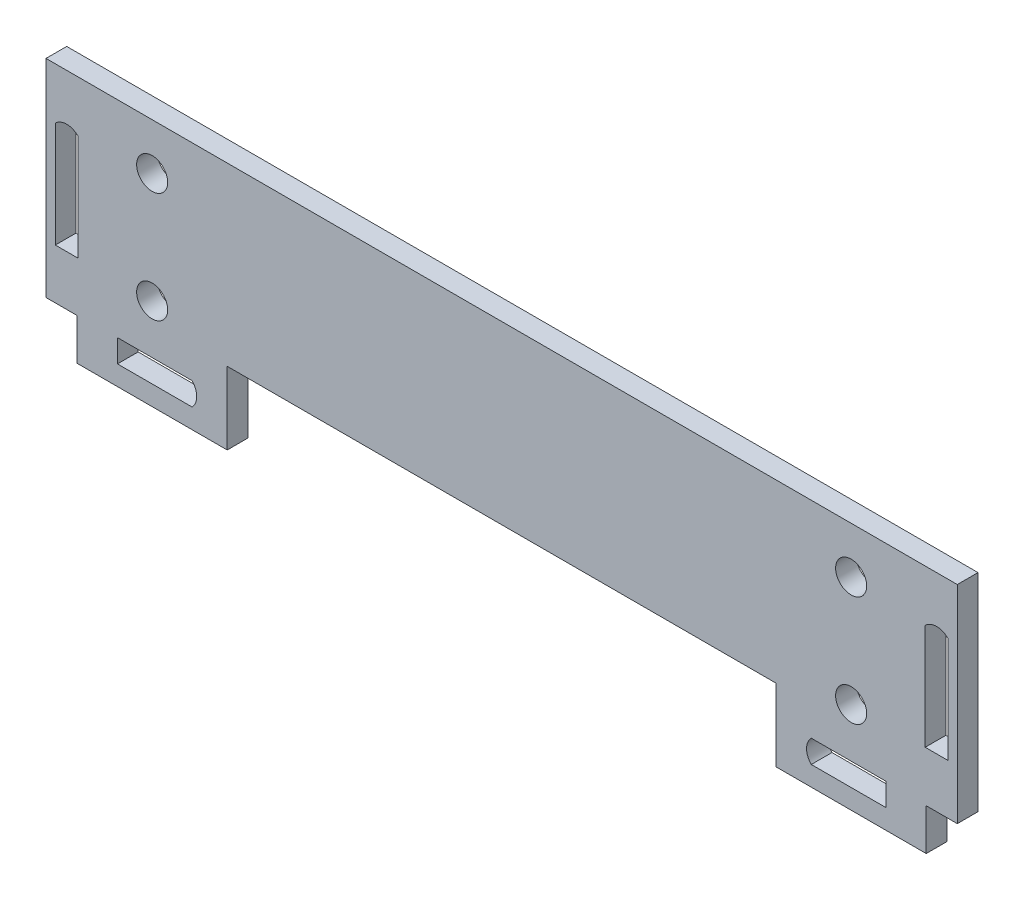
ISO-10303-21;
HEADER;
FILE_DESCRIPTION(('STEP AP214'),'2;1');
FILE_NAME('part.step','',(''),(''),'','','');
FILE_SCHEMA(('AUTOMOTIVE_DESIGN { 1 0 10303 214 1 1 1 1 }'));
ENDSEC;
DATA;
#1=APPLICATION_CONTEXT('core data for automotive mechanical design processes');
#2=APPLICATION_PROTOCOL_DEFINITION('international standard','automotive_design',2000,#1);
#3=PRODUCT_CONTEXT('',#1,'mechanical');
#4=PRODUCT('Part','Part','',(#3));
#5=PRODUCT_RELATED_PRODUCT_CATEGORY('part','',(#4));
#6=PRODUCT_DEFINITION_FORMATION('','',#4);
#7=PRODUCT_DEFINITION_CONTEXT('part definition',#1,'design');
#8=PRODUCT_DEFINITION('design','',#6,#7);
#9=PRODUCT_DEFINITION_SHAPE('','',#8);
#10=(LENGTH_UNIT() NAMED_UNIT(*) SI_UNIT(.MILLI.,.METRE.));
#11=(NAMED_UNIT(*) PLANE_ANGLE_UNIT() SI_UNIT($,.RADIAN.));
#12=(NAMED_UNIT(*) SI_UNIT($,.STERADIAN.) SOLID_ANGLE_UNIT());
#13=UNCERTAINTY_MEASURE_WITH_UNIT(LENGTH_MEASURE(1.E-05),#10,'distance_accuracy_value','');
#14=(GEOMETRIC_REPRESENTATION_CONTEXT(3) GLOBAL_UNCERTAINTY_ASSIGNED_CONTEXT((#13)) GLOBAL_UNIT_ASSIGNED_CONTEXT((#10,
#11,#12)) REPRESENTATION_CONTEXT('',''));
#15=CARTESIAN_POINT('',(0.,0.,0.));
#16=DIRECTION('',(0.,0.,1.));
#17=DIRECTION('',(1.,0.,0.));
#18=AXIS2_PLACEMENT_3D('',#15,#16,#17);
#19=CARTESIAN_POINT('',(0.,0.,2.));
#20=DIRECTION('',(0.,0.,1.));
#21=DIRECTION('',(1.,0.,0.));
#22=AXIS2_PLACEMENT_3D('',#19,#20,#21);
#23=PLANE('',#22);
#24=CARTESIAN_POINT('',(-33.7499999999939,4.84978331472722,2.));
#25=DIRECTION('',(0.,0.,1.));
#26=DIRECTION('',(1.,0.,0.));
#27=AXIS2_PLACEMENT_3D('',#24,#25,#26);
#28=CIRCLE('',#27,1.5);
#29=CARTESIAN_POINT('',(-32.2499999999939,4.84978331472722,2.));
#30=VERTEX_POINT('',#29);
#31=EDGE_CURVE('E830',#30,#30,#28,.T.);
#32=ORIENTED_EDGE('',*,*,#31,.F.);
#33=EDGE_LOOP('',(#32));
#34=FACE_BOUND('',#33,.T.);
#35=CARTESIAN_POINT('',(33.7499999999939,4.84978331472722,2.));
#36=DIRECTION('',(0.,0.,1.));
#37=DIRECTION('',(-1.,0.,0.));
#38=AXIS2_PLACEMENT_3D('',#35,#36,#37);
#39=CIRCLE('',#38,1.5);
#40=CARTESIAN_POINT('',(32.2499999999939,4.84978331472722,2.));
#41=VERTEX_POINT('',#40);
#42=EDGE_CURVE('E247',#41,#41,#39,.T.);
#43=ORIENTED_EDGE('',*,*,#42,.F.);
#44=EDGE_LOOP('',(#43));
#45=FACE_BOUND('',#44,.T.);
#46=DIRECTION('',(1.,0.,0.));
#47=VECTOR('',#46,1.);
#48=CARTESIAN_POINT('',(40.9999999999946,0.00978331472900346,2.));
#49=LINE('',#48,#47);
#50=CARTESIAN_POINT('',(40.9999999999946,0.00978331472900346,2.));
#51=VERTEX_POINT('',#50);
#52=CARTESIAN_POINT('',(43.9999999999958,0.00978331472900346,2.));
#53=VERTEX_POINT('',#52);
#54=EDGE_CURVE('E350',#51,#53,#49,.T.);
#55=ORIENTED_EDGE('',*,*,#54,.T.);
#56=DIRECTION('',(0.,1.,0.));
#57=VECTOR('',#56,1.);
#58=CARTESIAN_POINT('',(43.9999999999958,0.00978331472900346,2.));
#59=LINE('',#58,#57);
#60=CARTESIAN_POINT('',(43.9999999999958,20.0097833147254,2.));
#61=VERTEX_POINT('',#60);
#62=EDGE_CURVE('E353',#53,#61,#59,.T.);
#63=ORIENTED_EDGE('',*,*,#62,.T.);
#64=DIRECTION('',(-1.,0.,0.));
#65=VECTOR('',#64,1.);
#66=CARTESIAN_POINT('',(43.9999999999958,20.0097833147254,2.));
#67=LINE('',#66,#65);
#68=CARTESIAN_POINT('',(-43.9999999999958,20.0097833147254,2.));
#69=VERTEX_POINT('',#68);
#70=EDGE_CURVE('E356',#61,#69,#67,.T.);
#71=ORIENTED_EDGE('',*,*,#70,.T.);
#72=DIRECTION('',(0.,-1.,0.));
#73=VECTOR('',#72,1.);
#74=CARTESIAN_POINT('',(-43.9999999999958,15.0097833147254,2.));
#75=LINE('',#74,#73);
#76=CARTESIAN_POINT('',(-43.9999999999958,0.00978331472900346,2.));
#77=VERTEX_POINT('',#76);
#78=EDGE_CURVE('E358',#69,#77,#75,.T.);
#79=ORIENTED_EDGE('',*,*,#78,.T.);
#80=DIRECTION('',(1.,0.,0.));
#81=VECTOR('',#80,1.);
#82=CARTESIAN_POINT('',(-40.9999999999946,0.00978331472900346,2.));
#83=LINE('',#82,#81);
#84=CARTESIAN_POINT('',(-40.9999999999946,0.00978331472900346,2.));
#85=VERTEX_POINT('',#84);
#86=EDGE_CURVE('E360',#77,#85,#83,.T.);
#87=ORIENTED_EDGE('',*,*,#86,.T.);
#88=DIRECTION('',(0.,-1.,0.));
#89=VECTOR('',#88,1.);
#90=CARTESIAN_POINT('',(-40.9999999999946,0.00978331472900346,2.));
#91=LINE('',#90,#89);
#92=CARTESIAN_POINT('',(-40.9999999999946,-3.990216685271,2.));
#93=VERTEX_POINT('',#92);
#94=EDGE_CURVE('E362',#85,#93,#91,.T.);
#95=ORIENTED_EDGE('',*,*,#94,.T.);
#96=DIRECTION('',(1.,0.,0.));
#97=VECTOR('',#96,1.);
#98=CARTESIAN_POINT('',(-40.9999999999946,-3.990216685271,2.));
#99=LINE('',#98,#97);
#100=CARTESIAN_POINT('',(-26.4999999999946,-3.990216685271,2.));
#101=VERTEX_POINT('',#100);
#102=EDGE_CURVE('E364',#93,#101,#99,.T.);
#103=ORIENTED_EDGE('',*,*,#102,.T.);
#104=DIRECTION('',(0.,1.,0.));
#105=VECTOR('',#104,1.);
#106=CARTESIAN_POINT('',(-26.4999999999946,-3.990216685271,2.));
#107=LINE('',#106,#105);
#108=CARTESIAN_POINT('',(-26.4999999999946,3.009783314729,2.));
#109=VERTEX_POINT('',#108);
#110=EDGE_CURVE('E366',#101,#109,#107,.T.);
#111=ORIENTED_EDGE('',*,*,#110,.T.);
#112=DIRECTION('',(1.,0.,0.));
#113=VECTOR('',#112,1.);
#114=CARTESIAN_POINT('',(-26.4999999999946,3.009783314729,2.));
#115=LINE('',#114,#113);
#116=CARTESIAN_POINT('',(26.4999999999946,3.009783314729,2.));
#117=VERTEX_POINT('',#116);
#118=EDGE_CURVE('E368',#109,#117,#115,.T.);
#119=ORIENTED_EDGE('',*,*,#118,.T.);
#120=DIRECTION('',(0.,-1.,0.));
#121=VECTOR('',#120,1.);
#122=CARTESIAN_POINT('',(26.4999999999946,-3.990216685271,2.));
#123=LINE('',#122,#121);
#124=CARTESIAN_POINT('',(26.4999999999946,-3.990216685271,2.));
#125=VERTEX_POINT('',#124);
#126=EDGE_CURVE('E370',#117,#125,#123,.T.);
#127=ORIENTED_EDGE('',*,*,#126,.T.);
#128=DIRECTION('',(1.,0.,0.));
#129=VECTOR('',#128,1.);
#130=CARTESIAN_POINT('',(40.9999999999946,-3.990216685271,2.));
#131=LINE('',#130,#129);
#132=CARTESIAN_POINT('',(40.9999999999946,-3.990216685271,2.));
#133=VERTEX_POINT('',#132);
#134=EDGE_CURVE('E372',#125,#133,#131,.T.);
#135=ORIENTED_EDGE('',*,*,#134,.T.);
#136=DIRECTION('',(0.,1.,0.));
#137=VECTOR('',#136,1.);
#138=CARTESIAN_POINT('',(40.9999999999946,0.00978331472900346,2.));
#139=LINE('',#138,#137);
#140=EDGE_CURVE('E374',#133,#51,#139,.T.);
#141=ORIENTED_EDGE('',*,*,#140,.T.);
#142=EDGE_LOOP('',(#55,#63,#71,#79,#87,#95,#103,#111,#119,#127,#135,#141));
#143=FACE_BOUND('',#142,.T.);
#144=CARTESIAN_POINT('',(41.9999999999946,13.9497833147272,2.));
#145=DIRECTION('',(0.,0.,1.));
#146=DIRECTION('',(-1.,0.,0.));
#147=AXIS2_PLACEMENT_3D('',#144,#145,#146);
#148=CIRCLE('',#147,1.55563491861041);
#149=CARTESIAN_POINT('',(43.0999999999946,15.0497833147272,2.));
#150=VERTEX_POINT('',#149);
#151=CARTESIAN_POINT('',(40.8999999999946,15.0497833147272,2.));
#152=VERTEX_POINT('',#151);
#153=EDGE_CURVE('E321',#150,#152,#148,.T.);
#154=ORIENTED_EDGE('',*,*,#153,.F.);
#155=DIRECTION('',(0.,1.,0.));
#156=VECTOR('',#155,1.);
#157=CARTESIAN_POINT('',(43.0999999999946,15.0497833147272,2.));
#158=LINE('',#157,#156);
#159=CARTESIAN_POINT('',(43.0999999999946,4.84978331472722,2.));
#160=VERTEX_POINT('',#159);
#161=EDGE_CURVE('E319',#160,#150,#158,.T.);
#162=ORIENTED_EDGE('',*,*,#161,.F.);
#163=DIRECTION('',(1.,0.,0.));
#164=VECTOR('',#163,1.);
#165=CARTESIAN_POINT('',(43.0999999999946,4.84978331472722,2.));
#166=LINE('',#165,#164);
#167=CARTESIAN_POINT('',(40.8999999999946,4.84978331472722,2.));
#168=VERTEX_POINT('',#167);
#169=EDGE_CURVE('E327',#168,#160,#166,.T.);
#170=ORIENTED_EDGE('',*,*,#169,.F.);
#171=DIRECTION('',(0.,-1.,0.));
#172=VECTOR('',#171,1.);
#173=CARTESIAN_POINT('',(40.8999999999946,15.0497833147272,2.));
#174=LINE('',#173,#172);
#175=EDGE_CURVE('E324',#152,#168,#174,.T.);
#176=ORIENTED_EDGE('',*,*,#175,.F.);
#177=EDGE_LOOP('',(#154,#162,#170,#176));
#178=FACE_BOUND('',#177,.T.);
#179=DIRECTION('',(-1.,0.,0.));
#180=VECTOR('',#179,1.);
#181=CARTESIAN_POINT('',(-37.0999999999946,0.109783314729003,2.));
#182=LINE('',#181,#180);
#183=CARTESIAN_POINT('',(-29.8999999999946,0.109783314729003,2.));
#184=VERTEX_POINT('',#183);
#185=CARTESIAN_POINT('',(-37.0999999999946,0.109783314729003,2.));
#186=VERTEX_POINT('',#185);
#187=EDGE_CURVE('E290',#184,#186,#182,.T.);
#188=ORIENTED_EDGE('',*,*,#187,.F.);
#189=CARTESIAN_POINT('',(-30.9999999999946,-0.990216685270997,2.));
#190=DIRECTION('',(0.,0.,1.));
#191=DIRECTION('',(-1.,0.,0.));
#192=AXIS2_PLACEMENT_3D('',#189,#190,#191);
#193=CIRCLE('',#192,1.5556349186104);
#194=CARTESIAN_POINT('',(-29.8999999999946,-2.090216685271,2.));
#195=VERTEX_POINT('',#194);
#196=EDGE_CURVE('E288',#195,#184,#193,.T.);
#197=ORIENTED_EDGE('',*,*,#196,.F.);
#198=DIRECTION('',(1.,0.,0.));
#199=VECTOR('',#198,1.);
#200=CARTESIAN_POINT('',(-37.0999999999946,-2.090216685271,2.));
#201=LINE('',#200,#199);
#202=CARTESIAN_POINT('',(-37.0999999999946,-2.090216685271,2.));
#203=VERTEX_POINT('',#202);
#204=EDGE_CURVE('E296',#203,#195,#201,.T.);
#205=ORIENTED_EDGE('',*,*,#204,.F.);
#206=DIRECTION('',(0.,-1.,0.));
#207=VECTOR('',#206,1.);
#208=CARTESIAN_POINT('',(-37.0999999999946,-2.090216685271,2.));
#209=LINE('',#208,#207);
#210=EDGE_CURVE('E293',#186,#203,#209,.T.);
#211=ORIENTED_EDGE('',*,*,#210,.F.);
#212=EDGE_LOOP('',(#188,#197,#205,#211));
#213=FACE_BOUND('',#212,.T.);
#214=CARTESIAN_POINT('',(-41.9999999999946,13.9497833147272,2.));
#215=DIRECTION('',(0.,0.,1.));
#216=DIRECTION('',(-1.,0.,0.));
#217=AXIS2_PLACEMENT_3D('',#214,#215,#216);
#218=CIRCLE('',#217,1.5556349186104);
#219=CARTESIAN_POINT('',(-40.8999999999946,15.0497833147272,2.));
#220=VERTEX_POINT('',#219);
#221=CARTESIAN_POINT('',(-43.0999999999946,15.0497833147272,2.));
#222=VERTEX_POINT('',#221);
#223=EDGE_CURVE('E259',#220,#222,#218,.T.);
#224=ORIENTED_EDGE('',*,*,#223,.F.);
#225=DIRECTION('',(0.,1.,0.));
#226=VECTOR('',#225,1.);
#227=CARTESIAN_POINT('',(-40.8999999999946,15.0497833147272,2.));
#228=LINE('',#227,#226);
#229=CARTESIAN_POINT('',(-40.8999999999946,4.84978331472722,2.));
#230=VERTEX_POINT('',#229);
#231=EDGE_CURVE('E257',#230,#220,#228,.T.);
#232=ORIENTED_EDGE('',*,*,#231,.F.);
#233=DIRECTION('',(1.,0.,0.));
#234=VECTOR('',#233,1.);
#235=CARTESIAN_POINT('',(-43.0999999999946,4.84978331472722,2.));
#236=LINE('',#235,#234);
#237=CARTESIAN_POINT('',(-43.0999999999946,4.84978331472722,2.));
#238=VERTEX_POINT('',#237);
#239=EDGE_CURVE('E265',#238,#230,#236,.T.);
#240=ORIENTED_EDGE('',*,*,#239,.F.);
#241=DIRECTION('',(0.,-1.,0.));
#242=VECTOR('',#241,1.);
#243=CARTESIAN_POINT('',(-43.0999999999946,15.0497833147272,2.));
#244=LINE('',#243,#242);
#245=EDGE_CURVE('E262',#222,#238,#244,.T.);
#246=ORIENTED_EDGE('',*,*,#245,.F.);
#247=EDGE_LOOP('',(#224,#232,#240,#246));
#248=FACE_BOUND('',#247,.T.);
#249=DIRECTION('',(1.,0.,0.));
#250=VECTOR('',#249,1.);
#251=CARTESIAN_POINT('',(37.0999999999946,-2.090216685271,2.));
#252=LINE('',#251,#250);
#253=CARTESIAN_POINT('',(29.8999999999946,-2.090216685271,2.));
#254=VERTEX_POINT('',#253);
#255=CARTESIAN_POINT('',(37.0999999999946,-2.090216685271,2.));
#256=VERTEX_POINT('',#255);
#257=EDGE_CURVE('E226',#254,#256,#252,.T.);
#258=ORIENTED_EDGE('',*,*,#257,.F.);
#259=CARTESIAN_POINT('',(30.9999999999946,-0.990216685270997,2.));
#260=DIRECTION('',(0.,0.,1.));
#261=DIRECTION('',(1.,0.,0.));
#262=AXIS2_PLACEMENT_3D('',#259,#260,#261);
#263=CIRCLE('',#262,1.5556349186104);
#264=CARTESIAN_POINT('',(29.8999999999946,0.109783314729003,2.));
#265=VERTEX_POINT('',#264);
#266=EDGE_CURVE('E218',#265,#254,#263,.T.);
#267=ORIENTED_EDGE('',*,*,#266,.F.);
#268=DIRECTION('',(-1.,0.,0.));
#269=VECTOR('',#268,1.);
#270=CARTESIAN_POINT('',(37.0999999999946,0.109783314729003,2.));
#271=LINE('',#270,#269);
#272=CARTESIAN_POINT('',(37.0999999999946,0.109783314729003,2.));
#273=VERTEX_POINT('',#272);
#274=EDGE_CURVE('E241',#273,#265,#271,.T.);
#275=ORIENTED_EDGE('',*,*,#274,.F.);
#276=DIRECTION('',(0.,1.,0.));
#277=VECTOR('',#276,1.);
#278=CARTESIAN_POINT('',(37.0999999999946,-2.090216685271,2.));
#279=LINE('',#278,#277);
#280=EDGE_CURVE('E239',#256,#273,#279,.T.);
#281=ORIENTED_EDGE('',*,*,#280,.F.);
#282=EDGE_LOOP('',(#258,#267,#275,#281));
#283=FACE_BOUND('',#282,.T.);
#284=CARTESIAN_POINT('',(-33.7499999999939,15.5097833147272,2.));
#285=DIRECTION('',(0.,0.,1.));
#286=DIRECTION('',(1.,0.,0.));
#287=AXIS2_PLACEMENT_3D('',#284,#285,#286);
#288=CIRCLE('',#287,1.5);
#289=CARTESIAN_POINT('',(-32.2499999999939,15.5097833147272,2.));
#290=VERTEX_POINT('',#289);
#291=EDGE_CURVE('E836',#290,#290,#288,.T.);
#292=ORIENTED_EDGE('',*,*,#291,.F.);
#293=EDGE_LOOP('',(#292));
#294=FACE_BOUND('',#293,.T.);
#295=CARTESIAN_POINT('',(33.7499999999939,15.5097833147272,2.));
#296=DIRECTION('',(0.,0.,1.));
#297=DIRECTION('',(-1.,0.,0.));
#298=AXIS2_PLACEMENT_3D('',#295,#296,#297);
#299=CIRCLE('',#298,1.5);
#300=CARTESIAN_POINT('',(32.2499999999939,15.5097833147272,2.));
#301=VERTEX_POINT('',#300);
#302=EDGE_CURVE('E821',#301,#301,#299,.T.);
#303=ORIENTED_EDGE('',*,*,#302,.F.);
#304=EDGE_LOOP('',(#303));
#305=FACE_BOUND('',#304,.T.);
#306=ADVANCED_FACE('F33',(#34,#45,#143,#178,#213,#248,#283,#294,#305),#23,.T.);
#307=CARTESIAN_POINT('',(0.,0.,0.));
#308=DIRECTION('',(0.,0.,1.));
#309=DIRECTION('',(1.,0.,0.));
#310=AXIS2_PLACEMENT_3D('',#307,#308,#309);
#311=PLANE('',#310);
#312=DIRECTION('',(0.,1.,0.));
#313=VECTOR('',#312,1.);
#314=CARTESIAN_POINT('',(-40.8999999999946,15.0497833147272,0.));
#315=LINE('',#314,#313);
#316=CARTESIAN_POINT('',(-40.8999999999946,4.84978331472722,0.));
#317=VERTEX_POINT('',#316);
#318=CARTESIAN_POINT('',(-40.8999999999946,15.0497833147272,0.));
#319=VERTEX_POINT('',#318);
#320=EDGE_CURVE('E234',#317,#319,#315,.T.);
#321=ORIENTED_EDGE('',*,*,#320,.T.);
#322=CARTESIAN_POINT('',(-41.9999999999946,13.9497833147272,0.));
#323=DIRECTION('',(0.,0.,1.));
#324=DIRECTION('',(-1.,0.,0.));
#325=AXIS2_PLACEMENT_3D('',#322,#323,#324);
#326=CIRCLE('',#325,1.5556349186104);
#327=CARTESIAN_POINT('',(-43.0999999999946,15.0497833147272,0.));
#328=VERTEX_POINT('',#327);
#329=EDGE_CURVE('E270',#319,#328,#326,.T.);
#330=ORIENTED_EDGE('',*,*,#329,.T.);
#331=DIRECTION('',(0.,-1.,0.));
#332=VECTOR('',#331,1.);
#333=CARTESIAN_POINT('',(-43.0999999999946,15.0497833147272,0.));
#334=LINE('',#333,#332);
#335=CARTESIAN_POINT('',(-43.0999999999946,4.84978331472722,0.));
#336=VERTEX_POINT('',#335);
#337=EDGE_CURVE('E273',#328,#336,#334,.T.);
#338=ORIENTED_EDGE('',*,*,#337,.T.);
#339=DIRECTION('',(1.,0.,0.));
#340=VECTOR('',#339,1.);
#341=CARTESIAN_POINT('',(-43.0999999999946,4.84978331472722,0.));
#342=LINE('',#341,#340);
#343=EDGE_CURVE('E260',#336,#317,#342,.T.);
#344=ORIENTED_EDGE('',*,*,#343,.T.);
#345=EDGE_LOOP('',(#321,#330,#338,#344));
#346=FACE_BOUND('',#345,.T.);
#347=DIRECTION('',(0.,1.,0.));
#348=VECTOR('',#347,1.);
#349=CARTESIAN_POINT('',(43.0999999999946,15.0497833147272,0.));
#350=LINE('',#349,#348);
#351=CARTESIAN_POINT('',(43.0999999999946,4.84978331472722,0.));
#352=VERTEX_POINT('',#351);
#353=CARTESIAN_POINT('',(43.0999999999946,15.0497833147272,0.));
#354=VERTEX_POINT('',#353);
#355=EDGE_CURVE('E318',#352,#354,#350,.T.);
#356=ORIENTED_EDGE('',*,*,#355,.T.);
#357=CARTESIAN_POINT('',(41.9999999999946,13.9497833147272,0.));
#358=DIRECTION('',(0.,0.,1.));
#359=DIRECTION('',(-1.,0.,0.));
#360=AXIS2_PLACEMENT_3D('',#357,#358,#359);
#361=CIRCLE('',#360,1.55563491861041);
#362=CARTESIAN_POINT('',(40.8999999999946,15.0497833147272,0.));
#363=VERTEX_POINT('',#362);
#364=EDGE_CURVE('E332',#354,#363,#361,.T.);
#365=ORIENTED_EDGE('',*,*,#364,.T.);
#366=DIRECTION('',(0.,-1.,0.));
#367=VECTOR('',#366,1.);
#368=CARTESIAN_POINT('',(40.8999999999946,15.0497833147272,0.));
#369=LINE('',#368,#367);
#370=CARTESIAN_POINT('',(40.8999999999946,4.84978331472722,0.));
#371=VERTEX_POINT('',#370);
#372=EDGE_CURVE('E335',#363,#371,#369,.T.);
#373=ORIENTED_EDGE('',*,*,#372,.T.);
#374=DIRECTION('',(1.,0.,0.));
#375=VECTOR('',#374,1.);
#376=CARTESIAN_POINT('',(43.0999999999946,4.84978331472722,0.));
#377=LINE('',#376,#375);
#378=EDGE_CURVE('E322',#371,#352,#377,.T.);
#379=ORIENTED_EDGE('',*,*,#378,.T.);
#380=EDGE_LOOP('',(#356,#365,#373,#379));
#381=FACE_BOUND('',#380,.T.);
#382=DIRECTION('',(1.,0.,0.));
#383=VECTOR('',#382,1.);
#384=CARTESIAN_POINT('',(40.9999999999946,0.00978331472900346,0.));
#385=LINE('',#384,#383);
#386=CARTESIAN_POINT('',(40.9999999999946,0.00978331472900346,0.));
#387=VERTEX_POINT('',#386);
#388=CARTESIAN_POINT('',(43.9999999999958,0.00978331472900346,0.));
#389=VERTEX_POINT('',#388);
#390=EDGE_CURVE('E349',#387,#389,#385,.T.);
#391=ORIENTED_EDGE('',*,*,#390,.F.);
#392=DIRECTION('',(0.,1.,0.));
#393=VECTOR('',#392,1.);
#394=CARTESIAN_POINT('',(40.9999999999946,0.00978331472900346,0.));
#395=LINE('',#394,#393);
#396=CARTESIAN_POINT('',(40.9999999999946,-3.990216685271,0.));
#397=VERTEX_POINT('',#396);
#398=EDGE_CURVE('E354',#397,#387,#395,.T.);
#399=ORIENTED_EDGE('',*,*,#398,.F.);
#400=DIRECTION('',(1.,0.,0.));
#401=VECTOR('',#400,1.);
#402=CARTESIAN_POINT('',(40.9999999999946,-3.990216685271,0.));
#403=LINE('',#402,#401);
#404=CARTESIAN_POINT('',(26.4999999999946,-3.990216685271,0.));
#405=VERTEX_POINT('',#404);
#406=EDGE_CURVE('E399',#405,#397,#403,.T.);
#407=ORIENTED_EDGE('',*,*,#406,.F.);
#408=DIRECTION('',(0.,-1.,0.));
#409=VECTOR('',#408,1.);
#410=CARTESIAN_POINT('',(26.4999999999946,-3.990216685271,0.));
#411=LINE('',#410,#409);
#412=CARTESIAN_POINT('',(26.4999999999946,3.009783314729,0.));
#413=VERTEX_POINT('',#412);
#414=EDGE_CURVE('E397',#413,#405,#411,.T.);
#415=ORIENTED_EDGE('',*,*,#414,.F.);
#416=DIRECTION('',(1.,0.,0.));
#417=VECTOR('',#416,1.);
#418=CARTESIAN_POINT('',(-26.4999999999946,3.009783314729,0.));
#419=LINE('',#418,#417);
#420=CARTESIAN_POINT('',(-26.4999999999946,3.009783314729,0.));
#421=VERTEX_POINT('',#420);
#422=EDGE_CURVE('E395',#421,#413,#419,.T.);
#423=ORIENTED_EDGE('',*,*,#422,.F.);
#424=DIRECTION('',(0.,1.,0.));
#425=VECTOR('',#424,1.);
#426=CARTESIAN_POINT('',(-26.4999999999946,-3.990216685271,0.));
#427=LINE('',#426,#425);
#428=CARTESIAN_POINT('',(-26.4999999999946,-3.990216685271,0.));
#429=VERTEX_POINT('',#428);
#430=EDGE_CURVE('E393',#429,#421,#427,.T.);
#431=ORIENTED_EDGE('',*,*,#430,.F.);
#432=DIRECTION('',(1.,0.,0.));
#433=VECTOR('',#432,1.);
#434=CARTESIAN_POINT('',(-40.9999999999946,-3.990216685271,0.));
#435=LINE('',#434,#433);
#436=CARTESIAN_POINT('',(-40.9999999999946,-3.990216685271,0.));
#437=VERTEX_POINT('',#436);
#438=EDGE_CURVE('E391',#437,#429,#435,.T.);
#439=ORIENTED_EDGE('',*,*,#438,.F.);
#440=DIRECTION('',(0.,-1.,0.));
#441=VECTOR('',#440,1.);
#442=CARTESIAN_POINT('',(-40.9999999999946,0.00978331472900346,0.));
#443=LINE('',#442,#441);
#444=CARTESIAN_POINT('',(-40.9999999999946,0.00978331472900346,0.));
#445=VERTEX_POINT('',#444);
#446=EDGE_CURVE('E389',#445,#437,#443,.T.);
#447=ORIENTED_EDGE('',*,*,#446,.F.);
#448=DIRECTION('',(1.,0.,0.));
#449=VECTOR('',#448,1.);
#450=CARTESIAN_POINT('',(-40.9999999999946,0.00978331472900346,0.));
#451=LINE('',#450,#449);
#452=CARTESIAN_POINT('',(-43.9999999999958,0.00978331472900346,0.));
#453=VERTEX_POINT('',#452);
#454=EDGE_CURVE('E387',#453,#445,#451,.T.);
#455=ORIENTED_EDGE('',*,*,#454,.F.);
#456=DIRECTION('',(0.,-1.,0.));
#457=VECTOR('',#456,1.);
#458=CARTESIAN_POINT('',(-43.9999999999958,0.00978331472900346,0.));
#459=LINE('',#458,#457);
#460=CARTESIAN_POINT('',(-43.9999999999958,20.0097833147254,0.));
#461=VERTEX_POINT('',#460);
#462=EDGE_CURVE('E385',#461,#453,#459,.T.);
#463=ORIENTED_EDGE('',*,*,#462,.F.);
#464=DIRECTION('',(-1.,0.,0.));
#465=VECTOR('',#464,1.);
#466=CARTESIAN_POINT('',(-43.9999999999958,20.0097833147254,0.));
#467=LINE('',#466,#465);
#468=CARTESIAN_POINT('',(43.9999999999958,20.0097833147254,0.));
#469=VERTEX_POINT('',#468);
#470=EDGE_CURVE('E382',#469,#461,#467,.T.);
#471=ORIENTED_EDGE('',*,*,#470,.F.);
#472=DIRECTION('',(0.,1.,0.));
#473=VECTOR('',#472,1.);
#474=CARTESIAN_POINT('',(43.9999999999958,15.0097833147254,0.));
#475=LINE('',#474,#473);
#476=EDGE_CURVE('E379',#389,#469,#475,.T.);
#477=ORIENTED_EDGE('',*,*,#476,.F.);
#478=EDGE_LOOP('',(#391,#399,#407,#415,#423,#431,#439,#447,#455,#463,#471,#477));
#479=FACE_BOUND('',#478,.T.);
#480=CARTESIAN_POINT('',(-30.9999999999946,-0.990216685270997,0.));
#481=DIRECTION('',(0.,0.,1.));
#482=DIRECTION('',(-1.,0.,0.));
#483=AXIS2_PLACEMENT_3D('',#480,#481,#482);
#484=CIRCLE('',#483,1.5556349186104);
#485=CARTESIAN_POINT('',(-29.8999999999946,-2.090216685271,0.));
#486=VERTEX_POINT('',#485);
#487=CARTESIAN_POINT('',(-29.8999999999946,0.109783314729003,0.));
#488=VERTEX_POINT('',#487);
#489=EDGE_CURVE('E287',#486,#488,#484,.T.);
#490=ORIENTED_EDGE('',*,*,#489,.T.);
#491=DIRECTION('',(-1.,0.,0.));
#492=VECTOR('',#491,1.);
#493=CARTESIAN_POINT('',(-37.0999999999946,0.109783314729003,0.));
#494=LINE('',#493,#492);
#495=CARTESIAN_POINT('',(-37.0999999999946,0.109783314729003,0.));
#496=VERTEX_POINT('',#495);
#497=EDGE_CURVE('E301',#488,#496,#494,.T.);
#498=ORIENTED_EDGE('',*,*,#497,.T.);
#499=DIRECTION('',(0.,-1.,0.));
#500=VECTOR('',#499,1.);
#501=CARTESIAN_POINT('',(-37.0999999999946,-2.090216685271,0.));
#502=LINE('',#501,#500);
#503=CARTESIAN_POINT('',(-37.0999999999946,-2.090216685271,0.));
#504=VERTEX_POINT('',#503);
#505=EDGE_CURVE('E304',#496,#504,#502,.T.);
#506=ORIENTED_EDGE('',*,*,#505,.T.);
#507=DIRECTION('',(1.,0.,0.));
#508=VECTOR('',#507,1.);
#509=CARTESIAN_POINT('',(-37.0999999999946,-2.090216685271,0.));
#510=LINE('',#509,#508);
#511=EDGE_CURVE('E291',#504,#486,#510,.T.);
#512=ORIENTED_EDGE('',*,*,#511,.T.);
#513=EDGE_LOOP('',(#490,#498,#506,#512));
#514=FACE_BOUND('',#513,.T.);
#515=CARTESIAN_POINT('',(30.9999999999946,-0.990216685270997,0.));
#516=DIRECTION('',(0.,0.,1.));
#517=DIRECTION('',(1.,0.,0.));
#518=AXIS2_PLACEMENT_3D('',#515,#516,#517);
#519=CIRCLE('',#518,1.5556349186104);
#520=CARTESIAN_POINT('',(29.8999999999946,0.109783314729003,0.));
#521=VERTEX_POINT('',#520);
#522=CARTESIAN_POINT('',(29.8999999999946,-2.090216685271,0.));
#523=VERTEX_POINT('',#522);
#524=EDGE_CURVE('E56',#521,#523,#519,.T.);
#525=ORIENTED_EDGE('',*,*,#524,.T.);
#526=DIRECTION('',(1.,0.,0.));
#527=VECTOR('',#526,1.);
#528=CARTESIAN_POINT('',(37.0999999999946,-2.090216685271,0.));
#529=LINE('',#528,#527);
#530=CARTESIAN_POINT('',(37.0999999999946,-2.090216685271,0.));
#531=VERTEX_POINT('',#530);
#532=EDGE_CURVE('E233',#523,#531,#529,.T.);
#533=ORIENTED_EDGE('',*,*,#532,.T.);
#534=DIRECTION('',(0.,1.,0.));
#535=VECTOR('',#534,1.);
#536=CARTESIAN_POINT('',(37.0999999999946,-2.090216685271,0.));
#537=LINE('',#536,#535);
#538=CARTESIAN_POINT('',(37.0999999999946,0.109783314729003,0.));
#539=VERTEX_POINT('',#538);
#540=EDGE_CURVE('E249',#531,#539,#537,.T.);
#541=ORIENTED_EDGE('',*,*,#540,.T.);
#542=DIRECTION('',(-1.,0.,0.));
#543=VECTOR('',#542,1.);
#544=CARTESIAN_POINT('',(37.0999999999946,0.109783314729003,0.));
#545=LINE('',#544,#543);
#546=EDGE_CURVE('E227',#539,#521,#545,.T.);
#547=ORIENTED_EDGE('',*,*,#546,.T.);
#548=EDGE_LOOP('',(#525,#533,#541,#547));
#549=FACE_BOUND('',#548,.T.);
#550=CARTESIAN_POINT('',(33.7499999999939,4.84978331472722,0.));
#551=DIRECTION('',(0.,0.,1.));
#552=DIRECTION('',(-1.,0.,0.));
#553=AXIS2_PLACEMENT_3D('',#550,#551,#552);
#554=CIRCLE('',#553,1.5);
#555=CARTESIAN_POINT('',(32.2499999999939,4.84978331472722,0.));
#556=VERTEX_POINT('',#555);
#557=EDGE_CURVE('E839',#556,#556,#554,.T.);
#558=ORIENTED_EDGE('',*,*,#557,.T.);
#559=EDGE_LOOP('',(#558));
#560=FACE_BOUND('',#559,.T.);
#561=CARTESIAN_POINT('',(-33.7499999999939,15.5097833147272,0.));
#562=DIRECTION('',(0.,0.,1.));
#563=DIRECTION('',(1.,0.,0.));
#564=AXIS2_PLACEMENT_3D('',#561,#562,#563);
#565=CIRCLE('',#564,1.5);
#566=CARTESIAN_POINT('',(-32.2499999999939,15.5097833147272,0.));
#567=VERTEX_POINT('',#566);
#568=EDGE_CURVE('E833',#567,#567,#565,.T.);
#569=ORIENTED_EDGE('',*,*,#568,.T.);
#570=EDGE_LOOP('',(#569));
#571=FACE_BOUND('',#570,.T.);
#572=CARTESIAN_POINT('',(-33.7499999999939,4.84978331472722,0.));
#573=DIRECTION('',(0.,0.,1.));
#574=DIRECTION('',(1.,0.,0.));
#575=AXIS2_PLACEMENT_3D('',#572,#573,#574);
#576=CIRCLE('',#575,1.5);
#577=CARTESIAN_POINT('',(-32.2499999999939,4.84978331472722,0.));
#578=VERTEX_POINT('',#577);
#579=EDGE_CURVE('E827',#578,#578,#576,.T.);
#580=ORIENTED_EDGE('',*,*,#579,.T.);
#581=EDGE_LOOP('',(#580));
#582=FACE_BOUND('',#581,.T.);
#583=CARTESIAN_POINT('',(33.7499999999939,15.5097833147272,0.));
#584=DIRECTION('',(0.,0.,1.));
#585=DIRECTION('',(-1.,0.,0.));
#586=AXIS2_PLACEMENT_3D('',#583,#584,#585);
#587=CIRCLE('',#586,1.5);
#588=CARTESIAN_POINT('',(32.2499999999939,15.5097833147272,0.));
#589=VERTEX_POINT('',#588);
#590=EDGE_CURVE('E824',#589,#589,#587,.T.);
#591=ORIENTED_EDGE('',*,*,#590,.T.);
#592=EDGE_LOOP('',(#591));
#593=FACE_BOUND('',#592,.T.);
#594=ADVANCED_FACE('F441',(#346,#381,#479,#514,#549,#560,#571,#582,#593),#311,.F.);
#595=CARTESIAN_POINT('',(40.9999999999946,0.00978331472900346,2.));
#596=DIRECTION('',(0.,1.,0.));
#597=DIRECTION('',(0.,0.,1.));
#598=AXIS2_PLACEMENT_3D('',#595,#596,#597);
#599=PLANE('',#598);
#600=ORIENTED_EDGE('',*,*,#390,.T.);
#601=DIRECTION('',(0.,0.,-1.));
#602=VECTOR('',#601,1.);
#603=CARTESIAN_POINT('',(43.9999999999958,0.00978331472900346,2.));
#604=LINE('',#603,#602);
#605=EDGE_CURVE('E11',#53,#389,#604,.T.);
#606=ORIENTED_EDGE('',*,*,#605,.F.);
#607=ORIENTED_EDGE('',*,*,#54,.F.);
#608=DIRECTION('',(0.,0.,-1.));
#609=VECTOR('',#608,1.);
#610=CARTESIAN_POINT('',(40.9999999999946,0.00978331472900346,2.));
#611=LINE('',#610,#609);
#612=EDGE_CURVE('E376',#51,#387,#611,.T.);
#613=ORIENTED_EDGE('',*,*,#612,.T.);
#614=EDGE_LOOP('',(#600,#606,#607,#613));
#615=FACE_BOUND('',#614,.T.);
#616=ADVANCED_FACE('F35',(#615),#599,.F.);
#617=CARTESIAN_POINT('',(43.9999999999958,15.0097833147254,2.));
#618=DIRECTION('',(-1.,0.,0.));
#619=DIRECTION('',(0.,0.,1.));
#620=AXIS2_PLACEMENT_3D('',#617,#618,#619);
#621=PLANE('',#620);
#622=ORIENTED_EDGE('',*,*,#476,.T.);
#623=DIRECTION('',(0.,0.,-1.));
#624=VECTOR('',#623,1.);
#625=CARTESIAN_POINT('',(43.9999999999958,20.0097833147254,2.));
#626=LINE('',#625,#624);
#627=EDGE_CURVE('E41',#61,#469,#626,.T.);
#628=ORIENTED_EDGE('',*,*,#627,.F.);
#629=ORIENTED_EDGE('',*,*,#62,.F.);
#630=ORIENTED_EDGE('',*,*,#605,.T.);
#631=EDGE_LOOP('',(#622,#628,#629,#630));
#632=FACE_BOUND('',#631,.T.);
#633=ADVANCED_FACE('F437',(#632),#621,.F.);
#634=CARTESIAN_POINT('',(-43.9999999999958,20.0097833147254,2.));
#635=DIRECTION('',(0.,-1.,0.));
#636=DIRECTION('',(0.,0.,-1.));
#637=AXIS2_PLACEMENT_3D('',#634,#635,#636);
#638=PLANE('',#637);
#639=ORIENTED_EDGE('',*,*,#470,.T.);
#640=DIRECTION('',(0.,0.,-1.));
#641=VECTOR('',#640,1.);
#642=CARTESIAN_POINT('',(-43.9999999999958,20.0097833147254,2.));
#643=LINE('',#642,#641);
#644=EDGE_CURVE('E428',#69,#461,#643,.T.);
#645=ORIENTED_EDGE('',*,*,#644,.F.);
#646=ORIENTED_EDGE('',*,*,#70,.F.);
#647=ORIENTED_EDGE('',*,*,#627,.T.);
#648=EDGE_LOOP('',(#639,#645,#646,#647));
#649=FACE_BOUND('',#648,.T.);
#650=ADVANCED_FACE('F434',(#649),#638,.F.);
#651=CARTESIAN_POINT('',(-43.9999999999958,0.00978331472900346,2.));
#652=DIRECTION('',(1.,0.,0.));
#653=DIRECTION('',(0.,1.,0.));
#654=AXIS2_PLACEMENT_3D('',#651,#652,#653);
#655=PLANE('',#654);
#656=ORIENTED_EDGE('',*,*,#462,.T.);
#657=DIRECTION('',(0.,0.,-1.));
#658=VECTOR('',#657,1.);
#659=CARTESIAN_POINT('',(-43.9999999999958,0.00978331472900346,2.));
#660=LINE('',#659,#658);
#661=EDGE_CURVE('E425',#77,#453,#660,.T.);
#662=ORIENTED_EDGE('',*,*,#661,.F.);
#663=ORIENTED_EDGE('',*,*,#78,.F.);
#664=ORIENTED_EDGE('',*,*,#644,.T.);
#665=EDGE_LOOP('',(#656,#662,#663,#664));
#666=FACE_BOUND('',#665,.T.);
#667=ADVANCED_FACE('F448',(#666),#655,.F.);
#668=CARTESIAN_POINT('',(-40.9999999999946,0.00978331472900346,2.));
#669=DIRECTION('',(0.,1.,0.));
#670=DIRECTION('',(0.,0.,1.));
#671=AXIS2_PLACEMENT_3D('',#668,#669,#670);
#672=PLANE('',#671);
#673=ORIENTED_EDGE('',*,*,#454,.T.);
#674=DIRECTION('',(0.,0.,-1.));
#675=VECTOR('',#674,1.);
#676=CARTESIAN_POINT('',(-40.9999999999946,0.00978331472900346,2.));
#677=LINE('',#676,#675);
#678=EDGE_CURVE('E422',#85,#445,#677,.T.);
#679=ORIENTED_EDGE('',*,*,#678,.F.);
#680=ORIENTED_EDGE('',*,*,#86,.F.);
#681=ORIENTED_EDGE('',*,*,#661,.T.);
#682=EDGE_LOOP('',(#673,#679,#680,#681));
#683=FACE_BOUND('',#682,.T.);
#684=ADVANCED_FACE('F452',(#683),#672,.F.);
#685=CARTESIAN_POINT('',(-40.9999999999946,0.00978331472900346,2.));
#686=DIRECTION('',(1.,0.,0.));
#687=DIRECTION('',(0.,0.,-1.));
#688=AXIS2_PLACEMENT_3D('',#685,#686,#687);
#689=PLANE('',#688);
#690=ORIENTED_EDGE('',*,*,#446,.T.);
#691=DIRECTION('',(0.,0.,-1.));
#692=VECTOR('',#691,1.);
#693=CARTESIAN_POINT('',(-40.9999999999946,-3.990216685271,2.));
#694=LINE('',#693,#692);
#695=EDGE_CURVE('E419',#93,#437,#694,.T.);
#696=ORIENTED_EDGE('',*,*,#695,.F.);
#697=ORIENTED_EDGE('',*,*,#94,.F.);
#698=ORIENTED_EDGE('',*,*,#678,.T.);
#699=EDGE_LOOP('',(#690,#696,#697,#698));
#700=FACE_BOUND('',#699,.T.);
#701=ADVANCED_FACE('F490',(#700),#689,.F.);
#702=CARTESIAN_POINT('',(-40.9999999999946,-3.990216685271,2.));
#703=DIRECTION('',(0.,1.,0.));
#704=DIRECTION('',(0.,0.,1.));
#705=AXIS2_PLACEMENT_3D('',#702,#703,#704);
#706=PLANE('',#705);
#707=ORIENTED_EDGE('',*,*,#438,.T.);
#708=DIRECTION('',(0.,0.,-1.));
#709=VECTOR('',#708,1.);
#710=CARTESIAN_POINT('',(-26.4999999999946,-3.990216685271,2.));
#711=LINE('',#710,#709);
#712=EDGE_CURVE('E416',#101,#429,#711,.T.);
#713=ORIENTED_EDGE('',*,*,#712,.F.);
#714=ORIENTED_EDGE('',*,*,#102,.F.);
#715=ORIENTED_EDGE('',*,*,#695,.T.);
#716=EDGE_LOOP('',(#707,#713,#714,#715));
#717=FACE_BOUND('',#716,.T.);
#718=ADVANCED_FACE('F488',(#717),#706,.F.);
#719=CARTESIAN_POINT('',(-26.4999999999946,-3.990216685271,2.));
#720=DIRECTION('',(-1.,0.,0.));
#721=DIRECTION('',(0.,0.,1.));
#722=AXIS2_PLACEMENT_3D('',#719,#720,#721);
#723=PLANE('',#722);
#724=ORIENTED_EDGE('',*,*,#430,.T.);
#725=DIRECTION('',(0.,0.,-1.));
#726=VECTOR('',#725,1.);
#727=CARTESIAN_POINT('',(-26.4999999999946,3.009783314729,2.));
#728=LINE('',#727,#726);
#729=EDGE_CURVE('E413',#109,#421,#728,.T.);
#730=ORIENTED_EDGE('',*,*,#729,.F.);
#731=ORIENTED_EDGE('',*,*,#110,.F.);
#732=ORIENTED_EDGE('',*,*,#712,.T.);
#733=EDGE_LOOP('',(#724,#730,#731,#732));
#734=FACE_BOUND('',#733,.T.);
#735=ADVANCED_FACE('F483',(#734),#723,.F.);
#736=CARTESIAN_POINT('',(-26.4999999999946,3.009783314729,2.));
#737=DIRECTION('',(0.,1.,0.));
#738=DIRECTION('',(0.,0.,1.));
#739=AXIS2_PLACEMENT_3D('',#736,#737,#738);
#740=PLANE('',#739);
#741=ORIENTED_EDGE('',*,*,#422,.T.);
#742=DIRECTION('',(0.,0.,-1.));
#743=VECTOR('',#742,1.);
#744=CARTESIAN_POINT('',(26.4999999999946,3.009783314729,2.));
#745=LINE('',#744,#743);
#746=EDGE_CURVE('E410',#117,#413,#745,.T.);
#747=ORIENTED_EDGE('',*,*,#746,.F.);
#748=ORIENTED_EDGE('',*,*,#118,.F.);
#749=ORIENTED_EDGE('',*,*,#729,.T.);
#750=EDGE_LOOP('',(#741,#747,#748,#749));
#751=FACE_BOUND('',#750,.T.);
#752=ADVANCED_FACE('F478',(#751),#740,.F.);
#753=CARTESIAN_POINT('',(26.4999999999946,-3.990216685271,2.));
#754=DIRECTION('',(1.,0.,0.));
#755=DIRECTION('',(0.,0.,-1.));
#756=AXIS2_PLACEMENT_3D('',#753,#754,#755);
#757=PLANE('',#756);
#758=ORIENTED_EDGE('',*,*,#414,.T.);
#759=DIRECTION('',(0.,0.,-1.));
#760=VECTOR('',#759,1.);
#761=CARTESIAN_POINT('',(26.4999999999946,-3.990216685271,2.));
#762=LINE('',#761,#760);
#763=EDGE_CURVE('E407',#125,#405,#762,.T.);
#764=ORIENTED_EDGE('',*,*,#763,.F.);
#765=ORIENTED_EDGE('',*,*,#126,.F.);
#766=ORIENTED_EDGE('',*,*,#746,.T.);
#767=EDGE_LOOP('',(#758,#764,#765,#766));
#768=FACE_BOUND('',#767,.T.);
#769=ADVANCED_FACE('F474',(#768),#757,.F.);
#770=CARTESIAN_POINT('',(40.9999999999946,-3.990216685271,2.));
#771=DIRECTION('',(0.,1.,0.));
#772=DIRECTION('',(-1.,0.,0.));
#773=AXIS2_PLACEMENT_3D('',#770,#771,#772);
#774=PLANE('',#773);
#775=ORIENTED_EDGE('',*,*,#406,.T.);
#776=DIRECTION('',(0.,0.,-1.));
#777=VECTOR('',#776,1.);
#778=CARTESIAN_POINT('',(40.9999999999946,-3.990216685271,2.));
#779=LINE('',#778,#777);
#780=EDGE_CURVE('E404',#133,#397,#779,.T.);
#781=ORIENTED_EDGE('',*,*,#780,.F.);
#782=ORIENTED_EDGE('',*,*,#134,.F.);
#783=ORIENTED_EDGE('',*,*,#763,.T.);
#784=EDGE_LOOP('',(#775,#781,#782,#783));
#785=FACE_BOUND('',#784,.T.);
#786=ADVANCED_FACE('F469',(#785),#774,.F.);
#787=CARTESIAN_POINT('',(40.9999999999946,0.00978331472900346,2.));
#788=DIRECTION('',(-1.,0.,0.));
#789=DIRECTION('',(0.,0.,1.));
#790=AXIS2_PLACEMENT_3D('',#787,#788,#789);
#791=PLANE('',#790);
#792=ORIENTED_EDGE('',*,*,#398,.T.);
#793=ORIENTED_EDGE('',*,*,#612,.F.);
#794=ORIENTED_EDGE('',*,*,#140,.F.);
#795=ORIENTED_EDGE('',*,*,#780,.T.);
#796=EDGE_LOOP('',(#792,#793,#794,#795));
#797=FACE_BOUND('',#796,.T.);
#798=ADVANCED_FACE('F463',(#797),#791,.F.);
#799=CARTESIAN_POINT('',(43.0999999999946,15.0497833147272,2.));
#800=DIRECTION('',(-1.,0.,0.));
#801=DIRECTION('',(0.,0.,1.));
#802=AXIS2_PLACEMENT_3D('',#799,#800,#801);
#803=PLANE('',#802);
#804=ORIENTED_EDGE('',*,*,#355,.F.);
#805=DIRECTION('',(0.,0.,-1.));
#806=VECTOR('',#805,1.);
#807=CARTESIAN_POINT('',(43.0999999999946,4.84978331472722,2.));
#808=LINE('',#807,#806);
#809=EDGE_CURVE('E329',#160,#352,#808,.T.);
#810=ORIENTED_EDGE('',*,*,#809,.F.);
#811=ORIENTED_EDGE('',*,*,#161,.T.);
#812=DIRECTION('',(0.,0.,-1.));
#813=VECTOR('',#812,1.);
#814=CARTESIAN_POINT('',(43.0999999999946,15.0497833147272,2.));
#815=LINE('',#814,#813);
#816=EDGE_CURVE('E346',#150,#354,#815,.T.);
#817=ORIENTED_EDGE('',*,*,#816,.T.);
#818=EDGE_LOOP('',(#804,#810,#811,#817));
#819=FACE_BOUND('',#818,.T.);
#820=ADVANCED_FACE('F510',(#819),#803,.T.);
#821=CARTESIAN_POINT('',(41.9999999999946,13.9497833147272,2.));
#822=DIRECTION('',(0.,0.,-1.));
#823=DIRECTION('',(-1.,0.,0.));
#824=AXIS2_PLACEMENT_3D('',#821,#822,#823);
#825=CYLINDRICAL_SURFACE('',#824,1.55563491861041);
#826=ORIENTED_EDGE('',*,*,#364,.F.);
#827=ORIENTED_EDGE('',*,*,#816,.F.);
#828=ORIENTED_EDGE('',*,*,#153,.T.);
#829=DIRECTION('',(0.,0.,-1.));
#830=VECTOR('',#829,1.);
#831=CARTESIAN_POINT('',(40.8999999999946,15.0497833147272,2.));
#832=LINE('',#831,#830);
#833=EDGE_CURVE('E344',#152,#363,#832,.T.);
#834=ORIENTED_EDGE('',*,*,#833,.T.);
#835=EDGE_LOOP('',(#826,#827,#828,#834));
#836=FACE_BOUND('',#835,.T.);
#837=ADVANCED_FACE('F548',(#836),#825,.F.);
#838=CARTESIAN_POINT('',(40.8999999999946,15.0497833147272,2.));
#839=DIRECTION('',(1.,0.,0.));
#840=DIRECTION('',(0.,0.,-1.));
#841=AXIS2_PLACEMENT_3D('',#838,#839,#840);
#842=PLANE('',#841);
#843=ORIENTED_EDGE('',*,*,#372,.F.);
#844=ORIENTED_EDGE('',*,*,#833,.F.);
#845=ORIENTED_EDGE('',*,*,#175,.T.);
#846=DIRECTION('',(0.,0.,-1.));
#847=VECTOR('',#846,1.);
#848=CARTESIAN_POINT('',(40.8999999999946,4.84978331472722,2.));
#849=LINE('',#848,#847);
#850=EDGE_CURVE('E342',#168,#371,#849,.T.);
#851=ORIENTED_EDGE('',*,*,#850,.T.);
#852=EDGE_LOOP('',(#843,#844,#845,#851));
#853=FACE_BOUND('',#852,.T.);
#854=ADVANCED_FACE('F555',(#853),#842,.T.);
#855=CARTESIAN_POINT('',(43.0999999999946,4.84978331472722,2.));
#856=DIRECTION('',(0.,1.,0.));
#857=DIRECTION('',(0.,0.,1.));
#858=AXIS2_PLACEMENT_3D('',#855,#856,#857);
#859=PLANE('',#858);
#860=ORIENTED_EDGE('',*,*,#378,.F.);
#861=ORIENTED_EDGE('',*,*,#850,.F.);
#862=ORIENTED_EDGE('',*,*,#169,.T.);
#863=ORIENTED_EDGE('',*,*,#809,.T.);
#864=EDGE_LOOP('',(#860,#861,#862,#863));
#865=FACE_BOUND('',#864,.T.);
#866=ADVANCED_FACE('F562',(#865),#859,.T.);
#867=CARTESIAN_POINT('',(-30.9999999999946,-0.990216685270997,2.));
#868=DIRECTION('',(0.,0.,-1.));
#869=DIRECTION('',(-1.,0.,0.));
#870=AXIS2_PLACEMENT_3D('',#867,#868,#869);
#871=CYLINDRICAL_SURFACE('',#870,1.5556349186104);
#872=ORIENTED_EDGE('',*,*,#489,.F.);
#873=DIRECTION('',(0.,0.,-1.));
#874=VECTOR('',#873,1.);
#875=CARTESIAN_POINT('',(-29.8999999999946,-2.090216685271,2.));
#876=LINE('',#875,#874);
#877=EDGE_CURVE('E298',#195,#486,#876,.T.);
#878=ORIENTED_EDGE('',*,*,#877,.F.);
#879=ORIENTED_EDGE('',*,*,#196,.T.);
#880=DIRECTION('',(0.,0.,-1.));
#881=VECTOR('',#880,1.);
#882=CARTESIAN_POINT('',(-29.8999999999946,0.109783314729003,2.));
#883=LINE('',#882,#881);
#884=EDGE_CURVE('E315',#184,#488,#883,.T.);
#885=ORIENTED_EDGE('',*,*,#884,.T.);
#886=EDGE_LOOP('',(#872,#878,#879,#885));
#887=FACE_BOUND('',#886,.T.);
#888=ADVANCED_FACE('F570',(#887),#871,.F.);
#889=CARTESIAN_POINT('',(-37.0999999999946,0.109783314729003,2.));
#890=DIRECTION('',(0.,-1.,0.));
#891=DIRECTION('',(0.,0.,-1.));
#892=AXIS2_PLACEMENT_3D('',#889,#890,#891);
#893=PLANE('',#892);
#894=ORIENTED_EDGE('',*,*,#497,.F.);
#895=ORIENTED_EDGE('',*,*,#884,.F.);
#896=ORIENTED_EDGE('',*,*,#187,.T.);
#897=DIRECTION('',(0.,0.,-1.));
#898=VECTOR('',#897,1.);
#899=CARTESIAN_POINT('',(-37.0999999999946,0.109783314729003,2.));
#900=LINE('',#899,#898);
#901=EDGE_CURVE('E313',#186,#496,#900,.T.);
#902=ORIENTED_EDGE('',*,*,#901,.T.);
#903=EDGE_LOOP('',(#894,#895,#896,#902));
#904=FACE_BOUND('',#903,.T.);
#905=ADVANCED_FACE('F578',(#904),#893,.T.);
#906=CARTESIAN_POINT('',(-37.0999999999946,-2.090216685271,2.));
#907=DIRECTION('',(1.,0.,0.));
#908=DIRECTION('',(0.,0.,-1.));
#909=AXIS2_PLACEMENT_3D('',#906,#907,#908);
#910=PLANE('',#909);
#911=ORIENTED_EDGE('',*,*,#505,.F.);
#912=ORIENTED_EDGE('',*,*,#901,.F.);
#913=ORIENTED_EDGE('',*,*,#210,.T.);
#914=DIRECTION('',(0.,0.,-1.));
#915=VECTOR('',#914,1.);
#916=CARTESIAN_POINT('',(-37.0999999999946,-2.090216685271,2.));
#917=LINE('',#916,#915);
#918=EDGE_CURVE('E311',#203,#504,#917,.T.);
#919=ORIENTED_EDGE('',*,*,#918,.T.);
#920=EDGE_LOOP('',(#911,#912,#913,#919));
#921=FACE_BOUND('',#920,.T.);
#922=ADVANCED_FACE('F586',(#921),#910,.T.);
#923=CARTESIAN_POINT('',(-37.0999999999946,-2.090216685271,2.));
#924=DIRECTION('',(0.,1.,0.));
#925=DIRECTION('',(0.,0.,1.));
#926=AXIS2_PLACEMENT_3D('',#923,#924,#925);
#927=PLANE('',#926);
#928=ORIENTED_EDGE('',*,*,#511,.F.);
#929=ORIENTED_EDGE('',*,*,#918,.F.);
#930=ORIENTED_EDGE('',*,*,#204,.T.);
#931=ORIENTED_EDGE('',*,*,#877,.T.);
#932=EDGE_LOOP('',(#928,#929,#930,#931));
#933=FACE_BOUND('',#932,.T.);
#934=ADVANCED_FACE('F594',(#933),#927,.T.);
#935=CARTESIAN_POINT('',(-40.8999999999946,15.0497833147272,2.));
#936=DIRECTION('',(-1.,0.,0.));
#937=DIRECTION('',(0.,0.,1.));
#938=AXIS2_PLACEMENT_3D('',#935,#936,#937);
#939=PLANE('',#938);
#940=ORIENTED_EDGE('',*,*,#320,.F.);
#941=DIRECTION('',(0.,0.,-1.));
#942=VECTOR('',#941,1.);
#943=CARTESIAN_POINT('',(-40.8999999999946,4.84978331472722,2.));
#944=LINE('',#943,#942);
#945=EDGE_CURVE('E267',#230,#317,#944,.T.);
#946=ORIENTED_EDGE('',*,*,#945,.F.);
#947=ORIENTED_EDGE('',*,*,#231,.T.);
#948=DIRECTION('',(0.,0.,-1.));
#949=VECTOR('',#948,1.);
#950=CARTESIAN_POINT('',(-40.8999999999946,15.0497833147272,2.));
#951=LINE('',#950,#949);
#952=EDGE_CURVE('E284',#220,#319,#951,.T.);
#953=ORIENTED_EDGE('',*,*,#952,.T.);
#954=EDGE_LOOP('',(#940,#946,#947,#953));
#955=FACE_BOUND('',#954,.T.);
#956=ADVANCED_FACE('F602',(#955),#939,.T.);
#957=CARTESIAN_POINT('',(-41.9999999999946,13.9497833147272,2.));
#958=DIRECTION('',(0.,0.,-1.));
#959=DIRECTION('',(-1.,0.,0.));
#960=AXIS2_PLACEMENT_3D('',#957,#958,#959);
#961=CYLINDRICAL_SURFACE('',#960,1.5556349186104);
#962=ORIENTED_EDGE('',*,*,#329,.F.);
#963=ORIENTED_EDGE('',*,*,#952,.F.);
#964=ORIENTED_EDGE('',*,*,#223,.T.);
#965=DIRECTION('',(0.,0.,-1.));
#966=VECTOR('',#965,1.);
#967=CARTESIAN_POINT('',(-43.0999999999946,15.0497833147272,2.));
#968=LINE('',#967,#966);
#969=EDGE_CURVE('E282',#222,#328,#968,.T.);
#970=ORIENTED_EDGE('',*,*,#969,.T.);
#971=EDGE_LOOP('',(#962,#963,#964,#970));
#972=FACE_BOUND('',#971,.T.);
#973=ADVANCED_FACE('F610',(#972),#961,.F.);
#974=CARTESIAN_POINT('',(-43.0999999999946,15.0497833147272,2.));
#975=DIRECTION('',(1.,0.,0.));
#976=DIRECTION('',(0.,0.,-1.));
#977=AXIS2_PLACEMENT_3D('',#974,#975,#976);
#978=PLANE('',#977);
#979=ORIENTED_EDGE('',*,*,#337,.F.);
#980=ORIENTED_EDGE('',*,*,#969,.F.);
#981=ORIENTED_EDGE('',*,*,#245,.T.);
#982=DIRECTION('',(0.,0.,-1.));
#983=VECTOR('',#982,1.);
#984=CARTESIAN_POINT('',(-43.0999999999946,4.84978331472722,2.));
#985=LINE('',#984,#983);
#986=EDGE_CURVE('E280',#238,#336,#985,.T.);
#987=ORIENTED_EDGE('',*,*,#986,.T.);
#988=EDGE_LOOP('',(#979,#980,#981,#987));
#989=FACE_BOUND('',#988,.T.);
#990=ADVANCED_FACE('F618',(#989),#978,.T.);
#991=CARTESIAN_POINT('',(-43.0999999999946,4.84978331472722,2.));
#992=DIRECTION('',(0.,1.,0.));
#993=DIRECTION('',(0.,0.,1.));
#994=AXIS2_PLACEMENT_3D('',#991,#992,#993);
#995=PLANE('',#994);
#996=ORIENTED_EDGE('',*,*,#343,.F.);
#997=ORIENTED_EDGE('',*,*,#986,.F.);
#998=ORIENTED_EDGE('',*,*,#239,.T.);
#999=ORIENTED_EDGE('',*,*,#945,.T.);
#1000=EDGE_LOOP('',(#996,#997,#998,#999));
#1001=FACE_BOUND('',#1000,.T.);
#1002=ADVANCED_FACE('F626',(#1001),#995,.T.);
#1003=CARTESIAN_POINT('',(30.9999999999946,-0.990216685270997,2.));
#1004=DIRECTION('',(0.,0.,-1.));
#1005=DIRECTION('',(-1.,0.,0.));
#1006=AXIS2_PLACEMENT_3D('',#1003,#1004,#1005);
#1007=CYLINDRICAL_SURFACE('',#1006,1.5556349186104);
#1008=ORIENTED_EDGE('',*,*,#524,.F.);
#1009=DIRECTION('',(0.,0.,-1.));
#1010=VECTOR('',#1009,1.);
#1011=CARTESIAN_POINT('',(29.8999999999946,0.109783314729003,2.));
#1012=LINE('',#1011,#1010);
#1013=EDGE_CURVE('E222',#265,#521,#1012,.T.);
#1014=ORIENTED_EDGE('',*,*,#1013,.F.);
#1015=ORIENTED_EDGE('',*,*,#266,.T.);
#1016=DIRECTION('',(0.,0.,-1.));
#1017=VECTOR('',#1016,1.);
#1018=CARTESIAN_POINT('',(29.8999999999946,-2.090216685271,2.));
#1019=LINE('',#1018,#1017);
#1020=EDGE_CURVE('E221',#254,#523,#1019,.T.);
#1021=ORIENTED_EDGE('',*,*,#1020,.T.);
#1022=EDGE_LOOP('',(#1008,#1014,#1015,#1021));
#1023=FACE_BOUND('',#1022,.T.);
#1024=ADVANCED_FACE('F220',(#1023),#1007,.F.);
#1025=CARTESIAN_POINT('',(37.0999999999946,-2.090216685271,2.));
#1026=DIRECTION('',(0.,1.,0.));
#1027=DIRECTION('',(0.,0.,1.));
#1028=AXIS2_PLACEMENT_3D('',#1025,#1026,#1027);
#1029=PLANE('',#1028);
#1030=ORIENTED_EDGE('',*,*,#532,.F.);
#1031=ORIENTED_EDGE('',*,*,#1020,.F.);
#1032=ORIENTED_EDGE('',*,*,#257,.T.);
#1033=DIRECTION('',(0.,0.,-1.));
#1034=VECTOR('',#1033,1.);
#1035=CARTESIAN_POINT('',(37.0999999999946,-2.090216685271,2.));
#1036=LINE('',#1035,#1034);
#1037=EDGE_CURVE('E235',#256,#531,#1036,.T.);
#1038=ORIENTED_EDGE('',*,*,#1037,.T.);
#1039=EDGE_LOOP('',(#1030,#1031,#1032,#1038));
#1040=FACE_BOUND('',#1039,.T.);
#1041=ADVANCED_FACE('F230',(#1040),#1029,.T.);
#1042=CARTESIAN_POINT('',(37.0999999999946,-2.090216685271,2.));
#1043=DIRECTION('',(-1.,0.,0.));
#1044=DIRECTION('',(0.,0.,1.));
#1045=AXIS2_PLACEMENT_3D('',#1042,#1043,#1044);
#1046=PLANE('',#1045);
#1047=ORIENTED_EDGE('',*,*,#540,.F.);
#1048=ORIENTED_EDGE('',*,*,#1037,.F.);
#1049=ORIENTED_EDGE('',*,*,#280,.T.);
#1050=DIRECTION('',(0.,0.,-1.));
#1051=VECTOR('',#1050,1.);
#1052=CARTESIAN_POINT('',(37.0999999999946,0.109783314729003,2.));
#1053=LINE('',#1052,#1051);
#1054=EDGE_CURVE('E48',#273,#539,#1053,.T.);
#1055=ORIENTED_EDGE('',*,*,#1054,.T.);
#1056=EDGE_LOOP('',(#1047,#1048,#1049,#1055));
#1057=FACE_BOUND('',#1056,.T.);
#1058=ADVANCED_FACE('F647',(#1057),#1046,.T.);
#1059=CARTESIAN_POINT('',(37.0999999999946,0.109783314729003,2.));
#1060=DIRECTION('',(0.,-1.,0.));
#1061=DIRECTION('',(0.,0.,-1.));
#1062=AXIS2_PLACEMENT_3D('',#1059,#1060,#1061);
#1063=PLANE('',#1062);
#1064=ORIENTED_EDGE('',*,*,#546,.F.);
#1065=ORIENTED_EDGE('',*,*,#1054,.F.);
#1066=ORIENTED_EDGE('',*,*,#274,.T.);
#1067=ORIENTED_EDGE('',*,*,#1013,.T.);
#1068=EDGE_LOOP('',(#1064,#1065,#1066,#1067));
#1069=FACE_BOUND('',#1068,.T.);
#1070=ADVANCED_FACE('F654',(#1069),#1063,.T.);
#1071=CARTESIAN_POINT('',(33.7499999999939,4.84978331472722,2.));
#1072=DIRECTION('',(0.,0.,-1.));
#1073=DIRECTION('',(-1.,0.,0.));
#1074=AXIS2_PLACEMENT_3D('',#1071,#1072,#1073);
#1075=CYLINDRICAL_SURFACE('',#1074,1.5);
#1076=ORIENTED_EDGE('',*,*,#42,.T.);
#1077=EDGE_LOOP('',(#1076));
#1078=FACE_BOUND('',#1077,.T.);
#1079=ORIENTED_EDGE('',*,*,#557,.F.);
#1080=EDGE_LOOP('',(#1079));
#1081=FACE_BOUND('',#1080,.T.);
#1082=ADVANCED_FACE('F662',(#1078,#1081),#1075,.F.);
#1083=CARTESIAN_POINT('',(-33.7499999999939,15.5097833147272,2.));
#1084=DIRECTION('',(0.,0.,-1.));
#1085=DIRECTION('',(-1.,0.,0.));
#1086=AXIS2_PLACEMENT_3D('',#1083,#1084,#1085);
#1087=CYLINDRICAL_SURFACE('',#1086,1.5);
#1088=ORIENTED_EDGE('',*,*,#291,.T.);
#1089=EDGE_LOOP('',(#1088));
#1090=FACE_BOUND('',#1089,.T.);
#1091=ORIENTED_EDGE('',*,*,#568,.F.);
#1092=EDGE_LOOP('',(#1091));
#1093=FACE_BOUND('',#1092,.T.);
#1094=ADVANCED_FACE('F669',(#1090,#1093),#1087,.F.);
#1095=CARTESIAN_POINT('',(-33.7499999999939,4.84978331472722,2.));
#1096=DIRECTION('',(0.,0.,-1.));
#1097=DIRECTION('',(-1.,0.,0.));
#1098=AXIS2_PLACEMENT_3D('',#1095,#1096,#1097);
#1099=CYLINDRICAL_SURFACE('',#1098,1.5);
#1100=ORIENTED_EDGE('',*,*,#31,.T.);
#1101=EDGE_LOOP('',(#1100));
#1102=FACE_BOUND('',#1101,.T.);
#1103=ORIENTED_EDGE('',*,*,#579,.F.);
#1104=EDGE_LOOP('',(#1103));
#1105=FACE_BOUND('',#1104,.T.);
#1106=ADVANCED_FACE('F677',(#1102,#1105),#1099,.F.);
#1107=CARTESIAN_POINT('',(33.7499999999939,15.5097833147272,2.));
#1108=DIRECTION('',(0.,0.,-1.));
#1109=DIRECTION('',(-1.,0.,0.));
#1110=AXIS2_PLACEMENT_3D('',#1107,#1108,#1109);
#1111=CYLINDRICAL_SURFACE('',#1110,1.5);
#1112=ORIENTED_EDGE('',*,*,#302,.T.);
#1113=EDGE_LOOP('',(#1112));
#1114=FACE_BOUND('',#1113,.T.);
#1115=ORIENTED_EDGE('',*,*,#590,.F.);
#1116=EDGE_LOOP('',(#1115));
#1117=FACE_BOUND('',#1116,.T.);
#1118=ADVANCED_FACE('F685',(#1114,#1117),#1111,.F.);
#1119=CLOSED_SHELL('',(#306,#594,#616,#633,#650,#667,#684,#701,#718,#735,#752,#769,#786,#798,
#820,#837,#854,#866,#888,#905,#922,#934,#956,#973,#990,#1002,#1024,#1041,#1058,#1070,#1082,
#1094,#1106,#1118));
#1120=MANIFOLD_SOLID_BREP('B2',#1119);
#1121=ADVANCED_BREP_SHAPE_REPRESENTATION('',(#18,#1120),#14);
#1122=SHAPE_DEFINITION_REPRESENTATION(#9,#1121);
ENDSEC;
END-ISO-10303-21;
